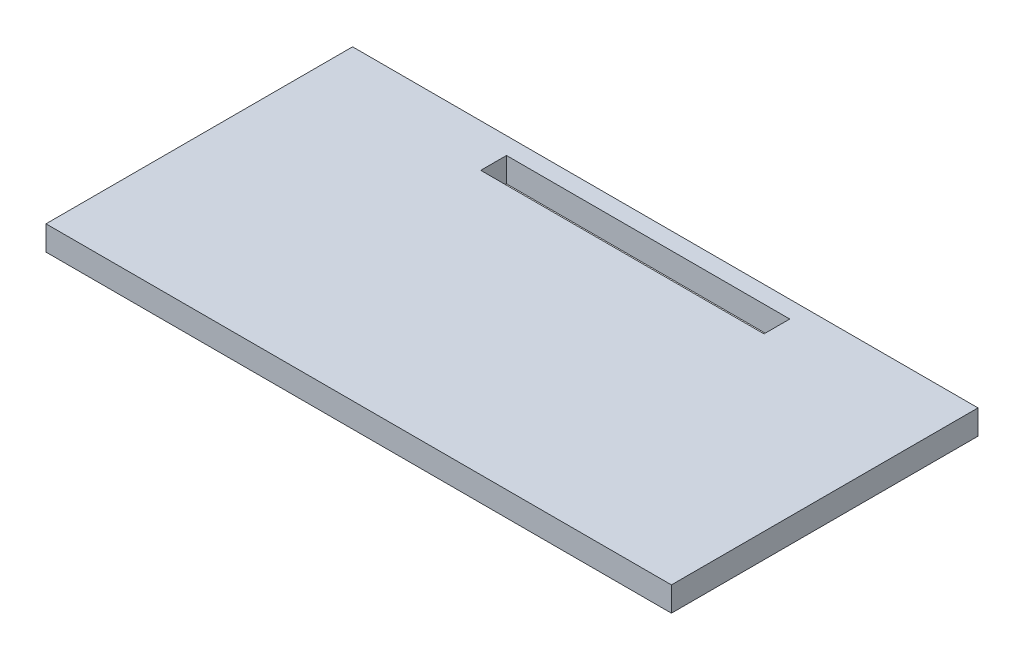
ISO-10303-21;
HEADER;
FILE_DESCRIPTION(('STEP AP214'),'2;1');
FILE_NAME('part.step','',(''),(''),'','','');
FILE_SCHEMA(('AUTOMOTIVE_DESIGN { 1 0 10303 214 1 1 1 1 }'));
ENDSEC;
DATA;
#1=APPLICATION_CONTEXT('core data for automotive mechanical design processes');
#2=APPLICATION_PROTOCOL_DEFINITION('international standard','automotive_design',2000,#1);
#3=PRODUCT_CONTEXT('',#1,'mechanical');
#4=PRODUCT('Part','Part','',(#3));
#5=PRODUCT_RELATED_PRODUCT_CATEGORY('part','',(#4));
#6=PRODUCT_DEFINITION_FORMATION('','',#4);
#7=PRODUCT_DEFINITION_CONTEXT('part definition',#1,'design');
#8=PRODUCT_DEFINITION('design','',#6,#7);
#9=PRODUCT_DEFINITION_SHAPE('','',#8);
#10=(LENGTH_UNIT() NAMED_UNIT(*) SI_UNIT(.MILLI.,.METRE.));
#11=(NAMED_UNIT(*) PLANE_ANGLE_UNIT() SI_UNIT($,.RADIAN.));
#12=(NAMED_UNIT(*) SI_UNIT($,.STERADIAN.) SOLID_ANGLE_UNIT());
#13=UNCERTAINTY_MEASURE_WITH_UNIT(LENGTH_MEASURE(1.E-05),#10,'distance_accuracy_value','');
#14=(GEOMETRIC_REPRESENTATION_CONTEXT(3) GLOBAL_UNCERTAINTY_ASSIGNED_CONTEXT((#13)) GLOBAL_UNIT_ASSIGNED_CONTEXT((#10,
#11,#12)) REPRESENTATION_CONTEXT('',''));
#15=CARTESIAN_POINT('',(0.,0.,0.));
#16=DIRECTION('',(0.,0.,1.));
#17=DIRECTION('',(1.,0.,0.));
#18=AXIS2_PLACEMENT_3D('',#15,#16,#17);
#19=CARTESIAN_POINT('',(-29.2215568862275,2.,-12.3952095808383));
#20=DIRECTION('',(1.,0.,0.));
#21=DIRECTION('',(0.,0.,-1.));
#22=AXIS2_PLACEMENT_3D('',#19,#20,#21);
#23=PLANE('',#22);
#24=DIRECTION('',(0.,0.,1.));
#25=VECTOR('',#24,1.);
#26=CARTESIAN_POINT('',(-29.2215568862275,0.,-12.3952095808383));
#27=LINE('',#26,#25);
#28=CARTESIAN_POINT('',(-29.2215568862275,0.,-12.3952095808383));
#29=VERTEX_POINT('',#28);
#30=CARTESIAN_POINT('',(-29.2215568862275,0.,12.6047904191617));
#31=VERTEX_POINT('',#30);
#32=EDGE_CURVE('E154',#29,#31,#27,.T.);
#33=ORIENTED_EDGE('',*,*,#32,.T.);
#34=DIRECTION('',(0.,-1.,0.));
#35=VECTOR('',#34,1.);
#36=CARTESIAN_POINT('',(-29.2215568862275,2.,12.6047904191617));
#37=LINE('',#36,#35);
#38=CARTESIAN_POINT('',(-29.2215568862275,2.,12.6047904191617));
#39=VERTEX_POINT('',#38);
#40=EDGE_CURVE('E173',#39,#31,#37,.T.);
#41=ORIENTED_EDGE('',*,*,#40,.F.);
#42=DIRECTION('',(0.,0.,1.));
#43=VECTOR('',#42,1.);
#44=CARTESIAN_POINT('',(-29.2215568862275,2.,-12.3952095808383));
#45=LINE('',#44,#43);
#46=CARTESIAN_POINT('',(-29.2215568862275,2.,-12.3952095808383));
#47=VERTEX_POINT('',#46);
#48=EDGE_CURVE('E155',#47,#39,#45,.T.);
#49=ORIENTED_EDGE('',*,*,#48,.F.);
#50=DIRECTION('',(0.,-1.,0.));
#51=VECTOR('',#50,1.);
#52=CARTESIAN_POINT('',(-29.2215568862275,2.,-12.3952095808383));
#53=LINE('',#52,#51);
#54=EDGE_CURVE('E161',#47,#29,#53,.T.);
#55=ORIENTED_EDGE('',*,*,#54,.T.);
#56=EDGE_LOOP('',(#33,#41,#49,#55));
#57=FACE_BOUND('',#56,.T.);
#58=ADVANCED_FACE('F43',(#57),#23,.F.);
#59=CARTESIAN_POINT('',(-29.2215568862275,2.,12.6047904191617));
#60=DIRECTION('',(0.,0.,-1.));
#61=DIRECTION('',(-1.,0.,0.));
#62=AXIS2_PLACEMENT_3D('',#59,#60,#61);
#63=PLANE('',#62);
#64=DIRECTION('',(1.,0.,0.));
#65=VECTOR('',#64,1.);
#66=CARTESIAN_POINT('',(-29.2215568862275,0.,12.6047904191617));
#67=LINE('',#66,#65);
#68=CARTESIAN_POINT('',(21.7784431137724,0.,12.6047904191617));
#69=VERTEX_POINT('',#68);
#70=EDGE_CURVE('E164',#31,#69,#67,.T.);
#71=ORIENTED_EDGE('',*,*,#70,.T.);
#72=DIRECTION('',(0.,-1.,0.));
#73=VECTOR('',#72,1.);
#74=CARTESIAN_POINT('',(21.7784431137724,2.,12.6047904191617));
#75=LINE('',#74,#73);
#76=CARTESIAN_POINT('',(21.7784431137724,2.,12.6047904191617));
#77=VERTEX_POINT('',#76);
#78=EDGE_CURVE('E171',#77,#69,#75,.T.);
#79=ORIENTED_EDGE('',*,*,#78,.F.);
#80=DIRECTION('',(1.,0.,0.));
#81=VECTOR('',#80,1.);
#82=CARTESIAN_POINT('',(-29.2215568862275,2.,12.6047904191617));
#83=LINE('',#82,#81);
#84=EDGE_CURVE('E91',#39,#77,#83,.T.);
#85=ORIENTED_EDGE('',*,*,#84,.F.);
#86=ORIENTED_EDGE('',*,*,#40,.T.);
#87=EDGE_LOOP('',(#71,#79,#85,#86));
#88=FACE_BOUND('',#87,.T.);
#89=ADVANCED_FACE('F195',(#88),#63,.F.);
#90=CARTESIAN_POINT('',(21.7784431137724,2.,-12.3952095808383));
#91=DIRECTION('',(-1.,0.,0.));
#92=DIRECTION('',(0.,0.,1.));
#93=AXIS2_PLACEMENT_3D('',#90,#91,#92);
#94=PLANE('',#93);
#95=DIRECTION('',(0.,0.,-1.));
#96=VECTOR('',#95,1.);
#97=CARTESIAN_POINT('',(21.7784431137724,0.,-12.3952095808383));
#98=LINE('',#97,#96);
#99=CARTESIAN_POINT('',(21.7784431137724,0.,-12.3952095808383));
#100=VERTEX_POINT('',#99);
#101=EDGE_CURVE('E77',#69,#100,#98,.T.);
#102=ORIENTED_EDGE('',*,*,#101,.T.);
#103=DIRECTION('',(0.,-1.,0.));
#104=VECTOR('',#103,1.);
#105=CARTESIAN_POINT('',(21.7784431137724,2.,-12.3952095808383));
#106=LINE('',#105,#104);
#107=CARTESIAN_POINT('',(21.7784431137724,2.,-12.3952095808383));
#108=VERTEX_POINT('',#107);
#109=EDGE_CURVE('E169',#108,#100,#106,.T.);
#110=ORIENTED_EDGE('',*,*,#109,.F.);
#111=DIRECTION('',(0.,0.,-1.));
#112=VECTOR('',#111,1.);
#113=CARTESIAN_POINT('',(21.7784431137724,2.,-12.3952095808383));
#114=LINE('',#113,#112);
#115=EDGE_CURVE('E158',#77,#108,#114,.T.);
#116=ORIENTED_EDGE('',*,*,#115,.F.);
#117=ORIENTED_EDGE('',*,*,#78,.T.);
#118=EDGE_LOOP('',(#102,#110,#116,#117));
#119=FACE_BOUND('',#118,.T.);
#120=ADVANCED_FACE('F200',(#119),#94,.F.);
#121=CARTESIAN_POINT('',(-29.2215568862275,2.,-12.3952095808383));
#122=DIRECTION('',(0.,0.,1.));
#123=DIRECTION('',(1.,0.,0.));
#124=AXIS2_PLACEMENT_3D('',#121,#122,#123);
#125=PLANE('',#124);
#126=DIRECTION('',(-1.,0.,0.));
#127=VECTOR('',#126,1.);
#128=CARTESIAN_POINT('',(-29.2215568862275,0.,-12.3952095808383));
#129=LINE('',#128,#127);
#130=EDGE_CURVE('E83',#100,#29,#129,.T.);
#131=ORIENTED_EDGE('',*,*,#130,.T.);
#132=ORIENTED_EDGE('',*,*,#54,.F.);
#133=DIRECTION('',(-1.,0.,0.));
#134=VECTOR('',#133,1.);
#135=CARTESIAN_POINT('',(-29.2215568862275,2.,-12.3952095808383));
#136=LINE('',#135,#134);
#137=EDGE_CURVE('E59',#108,#47,#136,.T.);
#138=ORIENTED_EDGE('',*,*,#137,.F.);
#139=ORIENTED_EDGE('',*,*,#109,.T.);
#140=EDGE_LOOP('',(#131,#132,#138,#139));
#141=FACE_BOUND('',#140,.T.);
#142=ADVANCED_FACE('F206',(#141),#125,.F.);
#143=CARTESIAN_POINT('',(0.,2.,0.));
#144=DIRECTION('',(0.,1.,0.));
#145=DIRECTION('',(0.,0.,1.));
#146=AXIS2_PLACEMENT_3D('',#143,#144,#145);
#147=PLANE('',#146);
#148=DIRECTION('',(0.,0.,1.));
#149=VECTOR('',#148,1.);
#150=CARTESIAN_POINT('',(-15.2715568862276,2.,-10.9952095808383));
#151=LINE('',#150,#149);
#152=CARTESIAN_POINT('',(-15.2715568862276,2.,-10.9952095808383));
#153=VERTEX_POINT('',#152);
#154=CARTESIAN_POINT('',(-15.2715568862276,2.,-8.89520958083832));
#155=VERTEX_POINT('',#154);
#156=EDGE_CURVE('E122',#153,#155,#151,.T.);
#157=ORIENTED_EDGE('',*,*,#156,.F.);
#158=DIRECTION('',(-1.,0.,0.));
#159=VECTOR('',#158,1.);
#160=CARTESIAN_POINT('',(0.,2.,-10.9952095808383));
#161=LINE('',#160,#159);
#162=CARTESIAN_POINT('',(7.82844311377245,2.,-10.9952095808383));
#163=VERTEX_POINT('',#162);
#164=EDGE_CURVE('E128',#163,#153,#161,.T.);
#165=ORIENTED_EDGE('',*,*,#164,.F.);
#166=DIRECTION('',(0.,0.,-1.));
#167=VECTOR('',#166,1.);
#168=CARTESIAN_POINT('',(7.82844311377245,2.,-10.9952095808383));
#169=LINE('',#168,#167);
#170=CARTESIAN_POINT('',(7.82844311377245,2.,-8.89520958083832));
#171=VERTEX_POINT('',#170);
#172=EDGE_CURVE('E124',#171,#163,#169,.T.);
#173=ORIENTED_EDGE('',*,*,#172,.F.);
#174=DIRECTION('',(1.,0.,0.));
#175=VECTOR('',#174,1.);
#176=CARTESIAN_POINT('',(0.,2.,-8.89520958083832));
#177=LINE('',#176,#175);
#178=EDGE_CURVE('E118',#155,#171,#177,.T.);
#179=ORIENTED_EDGE('',*,*,#178,.F.);
#180=EDGE_LOOP('',(#157,#165,#173,#179));
#181=FACE_BOUND('',#180,.T.);
#182=ORIENTED_EDGE('',*,*,#48,.T.);
#183=ORIENTED_EDGE('',*,*,#84,.T.);
#184=ORIENTED_EDGE('',*,*,#115,.T.);
#185=ORIENTED_EDGE('',*,*,#137,.T.);
#186=EDGE_LOOP('',(#182,#183,#184,#185));
#187=FACE_BOUND('',#186,.T.);
#188=ADVANCED_FACE('F120',(#181,#187),#147,.T.);
#189=CARTESIAN_POINT('',(0.,0.,0.));
#190=DIRECTION('',(0.,1.,0.));
#191=DIRECTION('',(0.,0.,1.));
#192=AXIS2_PLACEMENT_3D('',#189,#190,#191);
#193=PLANE('',#192);
#194=DIRECTION('',(-1.,0.,0.));
#195=VECTOR('',#194,1.);
#196=CARTESIAN_POINT('',(-10.2715568862276,0.,-10.9952095808383));
#197=LINE('',#196,#195);
#198=CARTESIAN_POINT('',(7.82844311377245,0.,-10.9952095808383));
#199=VERTEX_POINT('',#198);
#200=CARTESIAN_POINT('',(-15.2715568862276,0.,-10.9952095808383));
#201=VERTEX_POINT('',#200);
#202=EDGE_CURVE('E129',#199,#201,#197,.T.);
#203=ORIENTED_EDGE('',*,*,#202,.T.);
#204=DIRECTION('',(0.,0.,1.));
#205=VECTOR('',#204,1.);
#206=CARTESIAN_POINT('',(-15.2715568862276,0.,0.));
#207=LINE('',#206,#205);
#208=CARTESIAN_POINT('',(-15.2715568862276,0.,-8.89520958083832));
#209=VERTEX_POINT('',#208);
#210=EDGE_CURVE('E11',#201,#209,#207,.T.);
#211=ORIENTED_EDGE('',*,*,#210,.T.);
#212=DIRECTION('',(1.,0.,0.));
#213=VECTOR('',#212,1.);
#214=CARTESIAN_POINT('',(-10.2715568862276,0.,-8.89520958083832));
#215=LINE('',#214,#213);
#216=CARTESIAN_POINT('',(7.82844311377245,0.,-8.89520958083832));
#217=VERTEX_POINT('',#216);
#218=EDGE_CURVE('E134',#209,#217,#215,.T.);
#219=ORIENTED_EDGE('',*,*,#218,.T.);
#220=DIRECTION('',(0.,0.,-1.));
#221=VECTOR('',#220,1.);
#222=CARTESIAN_POINT('',(7.82844311377245,0.,0.));
#223=LINE('',#222,#221);
#224=EDGE_CURVE('E51',#217,#199,#223,.T.);
#225=ORIENTED_EDGE('',*,*,#224,.T.);
#226=EDGE_LOOP('',(#203,#211,#219,#225));
#227=FACE_BOUND('',#226,.T.);
#228=ORIENTED_EDGE('',*,*,#32,.F.);
#229=ORIENTED_EDGE('',*,*,#130,.F.);
#230=ORIENTED_EDGE('',*,*,#101,.F.);
#231=ORIENTED_EDGE('',*,*,#70,.F.);
#232=EDGE_LOOP('',(#228,#229,#230,#231));
#233=FACE_BOUND('',#232,.T.);
#234=ADVANCED_FACE('F177',(#227,#233),#193,.F.);
#235=CARTESIAN_POINT('',(-10.2715568862276,0.,-10.9952095808383));
#236=DIRECTION('',(0.,0.,-1.));
#237=DIRECTION('',(-1.,0.,0.));
#238=AXIS2_PLACEMENT_3D('',#235,#236,#237);
#239=PLANE('',#238);
#240=ORIENTED_EDGE('',*,*,#164,.T.);
#241=DIRECTION('',(0.,1.,0.));
#242=VECTOR('',#241,1.);
#243=CARTESIAN_POINT('',(-15.2715568862276,-8.,-10.9952095808383));
#244=LINE('',#243,#242);
#245=EDGE_CURVE('E142',#201,#153,#244,.T.);
#246=ORIENTED_EDGE('',*,*,#245,.F.);
#247=ORIENTED_EDGE('',*,*,#202,.F.);
#248=DIRECTION('',(0.,1.,0.));
#249=VECTOR('',#248,1.);
#250=CARTESIAN_POINT('',(7.82844311377245,-8.,-10.9952095808383));
#251=LINE('',#250,#249);
#252=EDGE_CURVE('E147',#199,#163,#251,.T.);
#253=ORIENTED_EDGE('',*,*,#252,.T.);
#254=EDGE_LOOP('',(#240,#246,#247,#253));
#255=FACE_BOUND('',#254,.T.);
#256=ADVANCED_FACE('F183',(#255),#239,.F.);
#257=CARTESIAN_POINT('',(-10.2715568862276,0.,-8.89520958083832));
#258=DIRECTION('',(0.,0.,1.));
#259=DIRECTION('',(1.,0.,0.));
#260=AXIS2_PLACEMENT_3D('',#257,#258,#259);
#261=PLANE('',#260);
#262=ORIENTED_EDGE('',*,*,#178,.T.);
#263=DIRECTION('',(0.,1.,0.));
#264=VECTOR('',#263,1.);
#265=CARTESIAN_POINT('',(7.82844311377245,-8.,-8.89520958083832));
#266=LINE('',#265,#264);
#267=EDGE_CURVE('E137',#217,#171,#266,.T.);
#268=ORIENTED_EDGE('',*,*,#267,.F.);
#269=ORIENTED_EDGE('',*,*,#218,.F.);
#270=DIRECTION('',(0.,1.,0.));
#271=VECTOR('',#270,1.);
#272=CARTESIAN_POINT('',(-15.2715568862276,-8.,-8.89520958083832));
#273=LINE('',#272,#271);
#274=EDGE_CURVE('E132',#209,#155,#273,.T.);
#275=ORIENTED_EDGE('',*,*,#274,.T.);
#276=EDGE_LOOP('',(#262,#268,#269,#275));
#277=FACE_BOUND('',#276,.T.);
#278=ADVANCED_FACE('F133',(#277),#261,.F.);
#279=CARTESIAN_POINT('',(7.82844311377245,-8.,-10.9952095808383));
#280=DIRECTION('',(1.,0.,0.));
#281=DIRECTION('',(0.,0.,-1.));
#282=AXIS2_PLACEMENT_3D('',#279,#280,#281);
#283=PLANE('',#282);
#284=ORIENTED_EDGE('',*,*,#267,.T.);
#285=ORIENTED_EDGE('',*,*,#172,.T.);
#286=ORIENTED_EDGE('',*,*,#252,.F.);
#287=ORIENTED_EDGE('',*,*,#224,.F.);
#288=EDGE_LOOP('',(#284,#285,#286,#287));
#289=FACE_BOUND('',#288,.T.);
#290=ADVANCED_FACE('F181',(#289),#283,.F.);
#291=CARTESIAN_POINT('',(-15.2715568862276,-8.,-10.9952095808383));
#292=DIRECTION('',(-1.,0.,0.));
#293=DIRECTION('',(0.,0.,1.));
#294=AXIS2_PLACEMENT_3D('',#291,#292,#293);
#295=PLANE('',#294);
#296=ORIENTED_EDGE('',*,*,#245,.T.);
#297=ORIENTED_EDGE('',*,*,#156,.T.);
#298=ORIENTED_EDGE('',*,*,#274,.F.);
#299=ORIENTED_EDGE('',*,*,#210,.F.);
#300=EDGE_LOOP('',(#296,#297,#298,#299));
#301=FACE_BOUND('',#300,.T.);
#302=ADVANCED_FACE('F140',(#301),#295,.F.);
#303=CLOSED_SHELL('',(#58,#89,#120,#142,#188,#234,#256,#278,#290,#302));
#304=MANIFOLD_SOLID_BREP('B2',#303);
#305=ADVANCED_BREP_SHAPE_REPRESENTATION('',(#18,#304),#14);
#306=SHAPE_DEFINITION_REPRESENTATION(#9,#305);
ENDSEC;
END-ISO-10303-21;
